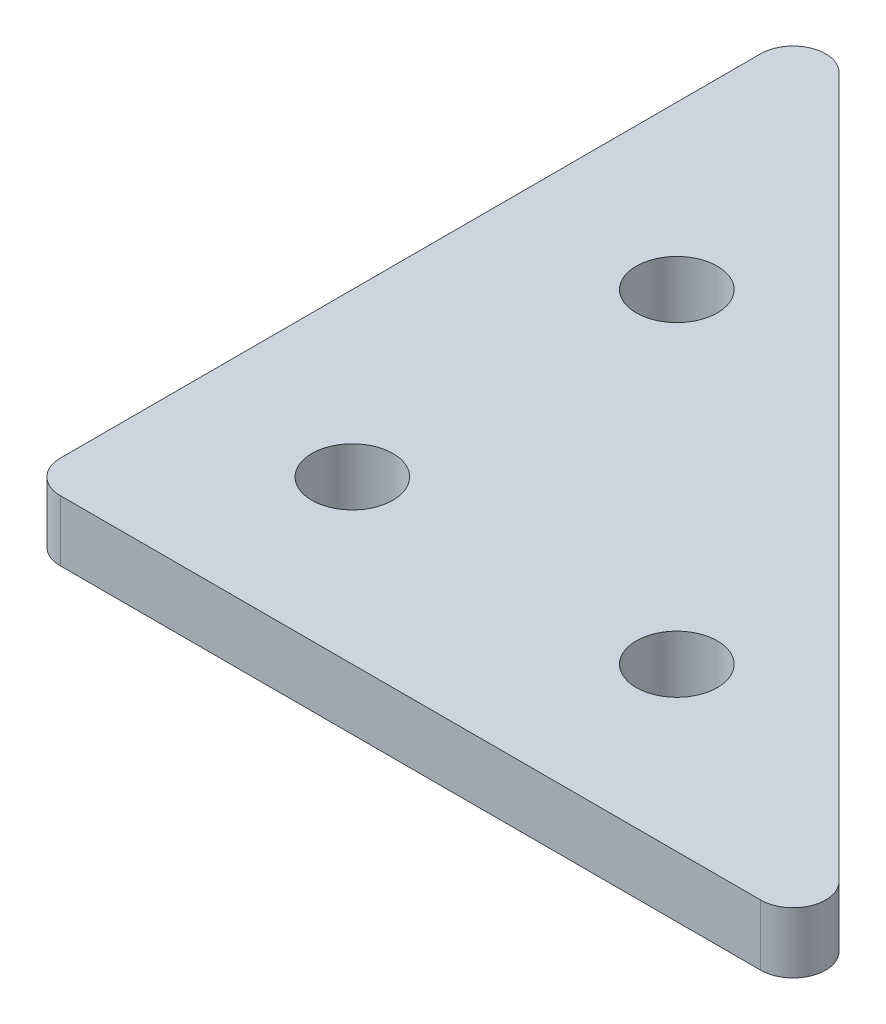
ISO-10303-21;
HEADER;
FILE_DESCRIPTION(('STEP AP214'),'2;1');
FILE_NAME('part.step','',(''),(''),'','','');
FILE_SCHEMA(('AUTOMOTIVE_DESIGN { 1 0 10303 214 1 1 1 1 }'));
ENDSEC;
DATA;
#1=APPLICATION_CONTEXT('core data for automotive mechanical design processes');
#2=APPLICATION_PROTOCOL_DEFINITION('international standard','automotive_design',2000,#1);
#3=PRODUCT_CONTEXT('',#1,'mechanical');
#4=PRODUCT('Part','Part','',(#3));
#5=PRODUCT_RELATED_PRODUCT_CATEGORY('part','',(#4));
#6=PRODUCT_DEFINITION_FORMATION('','',#4);
#7=PRODUCT_DEFINITION_CONTEXT('part definition',#1,'design');
#8=PRODUCT_DEFINITION('design','',#6,#7);
#9=PRODUCT_DEFINITION_SHAPE('','',#8);
#10=(LENGTH_UNIT() NAMED_UNIT(*) SI_UNIT(.MILLI.,.METRE.));
#11=(NAMED_UNIT(*) PLANE_ANGLE_UNIT() SI_UNIT($,.RADIAN.));
#12=(NAMED_UNIT(*) SI_UNIT($,.STERADIAN.) SOLID_ANGLE_UNIT());
#13=UNCERTAINTY_MEASURE_WITH_UNIT(LENGTH_MEASURE(1.E-05),#10,'distance_accuracy_value','');
#14=(GEOMETRIC_REPRESENTATION_CONTEXT(3) GLOBAL_UNCERTAINTY_ASSIGNED_CONTEXT((#13)) GLOBAL_UNIT_ASSIGNED_CONTEXT((#10,
#11,#12)) REPRESENTATION_CONTEXT('',''));
#15=CARTESIAN_POINT('',(0.,0.,0.));
#16=DIRECTION('',(0.,0.,1.));
#17=DIRECTION('',(1.,0.,0.));
#18=AXIS2_PLACEMENT_3D('',#15,#16,#17);
#19=CARTESIAN_POINT('',(-431.938028743073,4.7625,385.332748685498));
#20=DIRECTION('',(0.,-1.,0.));
#21=DIRECTION('',(0.,0.,-1.));
#22=AXIS2_PLACEMENT_3D('',#19,#20,#21);
#23=CYLINDRICAL_SURFACE('',#22,2.53999999999917);
#24=CARTESIAN_POINT('',(-431.938028743073,0.,385.332748685498));
#25=DIRECTION('',(0.,1.,0.));
#26=DIRECTION('',(0.,0.,-1.));
#27=AXIS2_PLACEMENT_3D('',#24,#25,#26);
#28=CIRCLE('',#27,2.53999999999917);
#29=CARTESIAN_POINT('',(-430.141977518862,0.,383.536697461284));
#30=VERTEX_POINT('',#29);
#31=CARTESIAN_POINT('',(-434.478028743073,0.,385.332748685498));
#32=VERTEX_POINT('',#31);
#33=EDGE_CURVE('E121',#30,#32,#28,.T.);
#34=ORIENTED_EDGE('',*,*,#33,.T.);
#35=DIRECTION('',(0.,-1.,0.));
#36=VECTOR('',#35,1.);
#37=CARTESIAN_POINT('',(-434.478028743073,4.7625,385.332748685498));
#38=LINE('',#37,#36);
#39=CARTESIAN_POINT('',(-434.478028743073,4.7625,385.332748685498));
#40=VERTEX_POINT('',#39);
#41=EDGE_CURVE('E11',#40,#32,#38,.T.);
#42=ORIENTED_EDGE('',*,*,#41,.F.);
#43=CARTESIAN_POINT('',(-431.938028743073,4.7625,385.332748685498));
#44=DIRECTION('',(0.,1.,0.));
#45=DIRECTION('',(0.,0.,-1.));
#46=AXIS2_PLACEMENT_3D('',#43,#44,#45);
#47=CIRCLE('',#46,2.53999999999917);
#48=CARTESIAN_POINT('',(-430.141977518862,4.7625,383.536697461284));
#49=VERTEX_POINT('',#48);
#50=EDGE_CURVE('E132',#49,#40,#47,.T.);
#51=ORIENTED_EDGE('',*,*,#50,.F.);
#52=DIRECTION('',(0.,-1.,0.));
#53=VECTOR('',#52,1.);
#54=CARTESIAN_POINT('',(-430.141977518862,4.7625,383.536697461284));
#55=LINE('',#54,#53);
#56=EDGE_CURVE('E117',#49,#30,#55,.T.);
#57=ORIENTED_EDGE('',*,*,#56,.T.);
#58=EDGE_LOOP('',(#34,#42,#51,#57));
#59=FACE_BOUND('',#58,.T.);
#60=ADVANCED_FACE('F37',(#59),#23,.T.);
#61=CARTESIAN_POINT('',(-434.478028743073,4.7625,440.16064623707));
#62=DIRECTION('',(1.,0.,0.));
#63=DIRECTION('',(0.,0.,-1.));
#64=AXIS2_PLACEMENT_3D('',#61,#62,#63);
#65=PLANE('',#64);
#66=DIRECTION('',(0.,0.,1.));
#67=VECTOR('',#66,1.);
#68=CARTESIAN_POINT('',(-434.478028743073,0.,440.16064623707));
#69=LINE('',#68,#67);
#70=CARTESIAN_POINT('',(-434.478028743073,0.,440.16064623707));
#71=VERTEX_POINT('',#70);
#72=EDGE_CURVE('E124',#32,#71,#69,.T.);
#73=ORIENTED_EDGE('',*,*,#72,.T.);
#74=DIRECTION('',(0.,-1.,0.));
#75=VECTOR('',#74,1.);
#76=CARTESIAN_POINT('',(-434.478028743073,4.7625,440.16064623707));
#77=LINE('',#76,#75);
#78=CARTESIAN_POINT('',(-434.478028743073,4.7625,440.16064623707));
#79=VERTEX_POINT('',#78);
#80=EDGE_CURVE('E45',#79,#71,#77,.T.);
#81=ORIENTED_EDGE('',*,*,#80,.F.);
#82=DIRECTION('',(0.,0.,1.));
#83=VECTOR('',#82,1.);
#84=CARTESIAN_POINT('',(-434.478028743073,4.7625,440.16064623707));
#85=LINE('',#84,#83);
#86=EDGE_CURVE('E90',#40,#79,#85,.T.);
#87=ORIENTED_EDGE('',*,*,#86,.F.);
#88=ORIENTED_EDGE('',*,*,#41,.T.);
#89=EDGE_LOOP('',(#73,#81,#87,#88));
#90=FACE_BOUND('',#89,.T.);
#91=ADVANCED_FACE('F157',(#90),#65,.F.);
#92=CARTESIAN_POINT('',(-431.938028743073,4.7625,440.160646237071));
#93=DIRECTION('',(0.,-1.,0.));
#94=DIRECTION('',(0.,0.,-1.));
#95=AXIS2_PLACEMENT_3D('',#92,#93,#94);
#96=CYLINDRICAL_SURFACE('',#95,2.53999999999999);
#97=CARTESIAN_POINT('',(-431.938028743073,0.,440.160646237071));
#98=DIRECTION('',(0.,1.,0.));
#99=DIRECTION('',(0.,0.,1.));
#100=AXIS2_PLACEMENT_3D('',#97,#98,#99);
#101=CIRCLE('',#100,2.53999999999999);
#102=CARTESIAN_POINT('',(-431.938028743073,0.,442.70064623707));
#103=VERTEX_POINT('',#102);
#104=EDGE_CURVE('E127',#71,#103,#101,.T.);
#105=ORIENTED_EDGE('',*,*,#104,.T.);
#106=DIRECTION('',(0.,-1.,0.));
#107=VECTOR('',#106,1.);
#108=CARTESIAN_POINT('',(-431.938028743073,4.7625,442.70064623707));
#109=LINE('',#108,#107);
#110=CARTESIAN_POINT('',(-431.938028743073,4.7625,442.70064623707));
#111=VERTEX_POINT('',#110);
#112=EDGE_CURVE('E112',#111,#103,#109,.T.);
#113=ORIENTED_EDGE('',*,*,#112,.F.);
#114=CARTESIAN_POINT('',(-431.938028743073,4.7625,440.160646237071));
#115=DIRECTION('',(0.,1.,0.));
#116=DIRECTION('',(0.,0.,1.));
#117=AXIS2_PLACEMENT_3D('',#114,#115,#116);
#118=CIRCLE('',#117,2.53999999999999);
#119=EDGE_CURVE('E103',#79,#111,#118,.T.);
#120=ORIENTED_EDGE('',*,*,#119,.F.);
#121=ORIENTED_EDGE('',*,*,#80,.T.);
#122=EDGE_LOOP('',(#105,#113,#120,#121));
#123=FACE_BOUND('',#122,.T.);
#124=ADVANCED_FACE('F138',(#123),#96,.T.);
#125=CARTESIAN_POINT('',(-431.938028743073,4.7625,442.70064623707));
#126=DIRECTION('',(0.,0.,-1.));
#127=DIRECTION('',(-1.,0.,0.));
#128=AXIS2_PLACEMENT_3D('',#125,#126,#127);
#129=PLANE('',#128);
#130=DIRECTION('',(1.,0.,0.));
#131=VECTOR('',#130,1.);
#132=CARTESIAN_POINT('',(-431.938028743073,0.,442.70064623707));
#133=LINE('',#132,#131);
#134=CARTESIAN_POINT('',(-377.110131191501,0.,442.70064623707));
#135=VERTEX_POINT('',#134);
#136=EDGE_CURVE('E111',#103,#135,#133,.T.);
#137=ORIENTED_EDGE('',*,*,#136,.T.);
#138=DIRECTION('',(0.,-1.,0.));
#139=VECTOR('',#138,1.);
#140=CARTESIAN_POINT('',(-377.110131191501,4.7625,442.70064623707));
#141=LINE('',#140,#139);
#142=CARTESIAN_POINT('',(-377.110131191501,4.7625,442.70064623707));
#143=VERTEX_POINT('',#142);
#144=EDGE_CURVE('E108',#143,#135,#141,.T.);
#145=ORIENTED_EDGE('',*,*,#144,.F.);
#146=DIRECTION('',(1.,0.,0.));
#147=VECTOR('',#146,1.);
#148=CARTESIAN_POINT('',(-431.938028743073,4.7625,442.70064623707));
#149=LINE('',#148,#147);
#150=EDGE_CURVE('E97',#111,#143,#149,.T.);
#151=ORIENTED_EDGE('',*,*,#150,.F.);
#152=ORIENTED_EDGE('',*,*,#112,.T.);
#153=EDGE_LOOP('',(#137,#145,#151,#152));
#154=FACE_BOUND('',#153,.T.);
#155=ADVANCED_FACE('F109',(#154),#129,.F.);
#156=CARTESIAN_POINT('',(-377.110131191501,4.7625,440.16064623707));
#157=DIRECTION('',(0.,-1.,0.));
#158=DIRECTION('',(0.,0.,-1.));
#159=AXIS2_PLACEMENT_3D('',#156,#157,#158);
#160=CYLINDRICAL_SURFACE('',#159,2.54000000000098);
#161=CARTESIAN_POINT('',(-377.110131191501,0.,440.16064623707));
#162=DIRECTION('',(0.,1.,0.));
#163=DIRECTION('',(0.,0.,-1.));
#164=AXIS2_PLACEMENT_3D('',#161,#162,#163);
#165=CIRCLE('',#164,2.54000000000098);
#166=CARTESIAN_POINT('',(-375.314079967288,0.,438.364595012854));
#167=VERTEX_POINT('',#166);
#168=EDGE_CURVE('E76',#135,#167,#165,.T.);
#169=ORIENTED_EDGE('',*,*,#168,.T.);
#170=DIRECTION('',(0.,-1.,0.));
#171=VECTOR('',#170,1.);
#172=CARTESIAN_POINT('',(-375.314079967288,4.7625,438.364595012854));
#173=LINE('',#172,#171);
#174=CARTESIAN_POINT('',(-375.314079967288,4.7625,438.364595012854));
#175=VERTEX_POINT('',#174);
#176=EDGE_CURVE('E113',#175,#167,#173,.T.);
#177=ORIENTED_EDGE('',*,*,#176,.F.);
#178=CARTESIAN_POINT('',(-377.110131191501,4.7625,440.16064623707));
#179=DIRECTION('',(0.,1.,0.));
#180=DIRECTION('',(0.,0.,-1.));
#181=AXIS2_PLACEMENT_3D('',#178,#179,#180);
#182=CIRCLE('',#181,2.54000000000098);
#183=EDGE_CURVE('E101',#143,#175,#182,.T.);
#184=ORIENTED_EDGE('',*,*,#183,.F.);
#185=ORIENTED_EDGE('',*,*,#144,.T.);
#186=EDGE_LOOP('',(#169,#177,#184,#185));
#187=FACE_BOUND('',#186,.T.);
#188=ADVANCED_FACE('F115',(#187),#160,.T.);
#189=CARTESIAN_POINT('',(-430.141977518862,4.7625,383.536697461284));
#190=DIRECTION('',(-0.707106781186514,0.,0.707106781186581));
#191=DIRECTION('',(0.707106781186581,0.,0.707106781186514));
#192=AXIS2_PLACEMENT_3D('',#189,#190,#191);
#193=PLANE('',#192);
#194=DIRECTION('',(-0.707106781186581,0.,-0.707106781186514));
#195=VECTOR('',#194,1.);
#196=CARTESIAN_POINT('',(-430.141977518862,0.,383.536697461284));
#197=LINE('',#196,#195);
#198=EDGE_CURVE('E82',#167,#30,#197,.T.);
#199=ORIENTED_EDGE('',*,*,#198,.T.);
#200=ORIENTED_EDGE('',*,*,#56,.F.);
#201=DIRECTION('',(-0.707106781186581,0.,-0.707106781186514));
#202=VECTOR('',#201,1.);
#203=CARTESIAN_POINT('',(-430.141977518862,4.7625,383.536697461284));
#204=LINE('',#203,#202);
#205=EDGE_CURVE('E53',#175,#49,#204,.T.);
#206=ORIENTED_EDGE('',*,*,#205,.F.);
#207=ORIENTED_EDGE('',*,*,#176,.T.);
#208=EDGE_LOOP('',(#199,#200,#206,#207));
#209=FACE_BOUND('',#208,.T.);
#210=ADVANCED_FACE('F145',(#209),#193,.F.);
#211=CARTESIAN_POINT('',(-431.938028743073,4.7625,385.332748685498));
#212=DIRECTION('',(0.,-1.,0.));
#213=DIRECTION('',(0.,0.,-1.));
#214=AXIS2_PLACEMENT_3D('',#211,#212,#213);
#215=PLANE('',#214);
#216=CARTESIAN_POINT('',(-421.77802874308,4.7625,404.600646237063));
#217=DIRECTION('',(0.,1.,0.));
#218=DIRECTION('',(0.,0.,1.));
#219=AXIS2_PLACEMENT_3D('',#216,#217,#218);
#220=CIRCLE('',#219,3.17499999999998);
#221=CARTESIAN_POINT('',(-421.77802874308,4.7625,407.775646237063));
#222=VERTEX_POINT('',#221);
#223=EDGE_CURVE('E269',#222,#222,#220,.T.);
#224=ORIENTED_EDGE('',*,*,#223,.F.);
#225=EDGE_LOOP('',(#224));
#226=FACE_BOUND('',#225,.T.);
#227=CARTESIAN_POINT('',(-421.77802874308,4.7625,430.000646237063));
#228=DIRECTION('',(0.,1.,0.));
#229=DIRECTION('',(0.,0.,1.));
#230=AXIS2_PLACEMENT_3D('',#227,#228,#229);
#231=CIRCLE('',#230,3.17499999999998);
#232=CARTESIAN_POINT('',(-421.77802874308,4.7625,433.175646237063));
#233=VERTEX_POINT('',#232);
#234=EDGE_CURVE('E271',#233,#233,#231,.T.);
#235=ORIENTED_EDGE('',*,*,#234,.F.);
#236=EDGE_LOOP('',(#235));
#237=FACE_BOUND('',#236,.T.);
#238=CARTESIAN_POINT('',(-396.37802874308,4.7625,430.000646237063));
#239=DIRECTION('',(0.,1.,0.));
#240=DIRECTION('',(0.,0.,1.));
#241=AXIS2_PLACEMENT_3D('',#238,#239,#240);
#242=CIRCLE('',#241,3.17499999999998);
#243=CARTESIAN_POINT('',(-396.37802874308,4.7625,433.175646237063));
#244=VERTEX_POINT('',#243);
#245=EDGE_CURVE('E279',#244,#244,#242,.T.);
#246=ORIENTED_EDGE('',*,*,#245,.F.);
#247=EDGE_LOOP('',(#246));
#248=FACE_BOUND('',#247,.T.);
#249=ORIENTED_EDGE('',*,*,#50,.T.);
#250=ORIENTED_EDGE('',*,*,#86,.T.);
#251=ORIENTED_EDGE('',*,*,#119,.T.);
#252=ORIENTED_EDGE('',*,*,#150,.T.);
#253=ORIENTED_EDGE('',*,*,#183,.T.);
#254=ORIENTED_EDGE('',*,*,#205,.T.);
#255=EDGE_LOOP('',(#249,#250,#251,#252,#253,#254));
#256=FACE_BOUND('',#255,.T.);
#257=ADVANCED_FACE('F99',(#226,#237,#248,#256),#215,.F.);
#258=CARTESIAN_POINT('',(-431.938028743073,0.,385.332748685498));
#259=DIRECTION('',(0.,-1.,0.));
#260=DIRECTION('',(0.,0.,-1.));
#261=AXIS2_PLACEMENT_3D('',#258,#259,#260);
#262=PLANE('',#261);
#263=CARTESIAN_POINT('',(-421.77802874308,0.,404.600646237063));
#264=DIRECTION('',(0.,1.,0.));
#265=DIRECTION('',(0.,0.,1.));
#266=AXIS2_PLACEMENT_3D('',#263,#264,#265);
#267=CIRCLE('',#266,3.17499999999998);
#268=CARTESIAN_POINT('',(-421.77802874308,0.,407.775646237063));
#269=VERTEX_POINT('',#268);
#270=EDGE_CURVE('E266',#269,#269,#267,.T.);
#271=ORIENTED_EDGE('',*,*,#270,.T.);
#272=EDGE_LOOP('',(#271));
#273=FACE_BOUND('',#272,.T.);
#274=CARTESIAN_POINT('',(-421.77802874308,0.,430.000646237063));
#275=DIRECTION('',(0.,1.,0.));
#276=DIRECTION('',(0.,0.,1.));
#277=AXIS2_PLACEMENT_3D('',#274,#275,#276);
#278=CIRCLE('',#277,3.17499999999998);
#279=CARTESIAN_POINT('',(-421.77802874308,0.,433.175646237063));
#280=VERTEX_POINT('',#279);
#281=EDGE_CURVE('E276',#280,#280,#278,.T.);
#282=ORIENTED_EDGE('',*,*,#281,.T.);
#283=EDGE_LOOP('',(#282));
#284=FACE_BOUND('',#283,.T.);
#285=CARTESIAN_POINT('',(-396.37802874308,0.,430.000646237063));
#286=DIRECTION('',(0.,1.,0.));
#287=DIRECTION('',(0.,0.,1.));
#288=AXIS2_PLACEMENT_3D('',#285,#286,#287);
#289=CIRCLE('',#288,3.17499999999998);
#290=CARTESIAN_POINT('',(-396.37802874308,0.,433.175646237063));
#291=VERTEX_POINT('',#290);
#292=EDGE_CURVE('E125',#291,#291,#289,.T.);
#293=ORIENTED_EDGE('',*,*,#292,.T.);
#294=EDGE_LOOP('',(#293));
#295=FACE_BOUND('',#294,.T.);
#296=ORIENTED_EDGE('',*,*,#33,.F.);
#297=ORIENTED_EDGE('',*,*,#198,.F.);
#298=ORIENTED_EDGE('',*,*,#168,.F.);
#299=ORIENTED_EDGE('',*,*,#136,.F.);
#300=ORIENTED_EDGE('',*,*,#104,.F.);
#301=ORIENTED_EDGE('',*,*,#72,.F.);
#302=EDGE_LOOP('',(#296,#297,#298,#299,#300,#301));
#303=FACE_BOUND('',#302,.T.);
#304=ADVANCED_FACE('F141',(#273,#284,#295,#303),#262,.T.);
#305=CARTESIAN_POINT('',(-396.37802874308,4.7625,430.000646237063));
#306=DIRECTION('',(0.,1.,0.));
#307=DIRECTION('',(0.,0.,1.));
#308=AXIS2_PLACEMENT_3D('',#305,#306,#307);
#309=CYLINDRICAL_SURFACE('',#308,3.17499999999998);
#310=ORIENTED_EDGE('',*,*,#292,.F.);
#311=EDGE_LOOP('',(#310));
#312=FACE_BOUND('',#311,.T.);
#313=ORIENTED_EDGE('',*,*,#245,.T.);
#314=EDGE_LOOP('',(#313));
#315=FACE_BOUND('',#314,.T.);
#316=ADVANCED_FACE('F197',(#312,#315),#309,.F.);
#317=CARTESIAN_POINT('',(-421.77802874308,4.7625,430.000646237063));
#318=DIRECTION('',(0.,1.,0.));
#319=DIRECTION('',(0.,0.,1.));
#320=AXIS2_PLACEMENT_3D('',#317,#318,#319);
#321=CYLINDRICAL_SURFACE('',#320,3.17499999999998);
#322=ORIENTED_EDGE('',*,*,#281,.F.);
#323=EDGE_LOOP('',(#322));
#324=FACE_BOUND('',#323,.T.);
#325=ORIENTED_EDGE('',*,*,#234,.T.);
#326=EDGE_LOOP('',(#325));
#327=FACE_BOUND('',#326,.T.);
#328=ADVANCED_FACE('F207',(#324,#327),#321,.F.);
#329=CARTESIAN_POINT('',(-421.77802874308,4.7625,404.600646237063));
#330=DIRECTION('',(0.,1.,0.));
#331=DIRECTION('',(0.,0.,1.));
#332=AXIS2_PLACEMENT_3D('',#329,#330,#331);
#333=CYLINDRICAL_SURFACE('',#332,3.17499999999998);
#334=ORIENTED_EDGE('',*,*,#270,.F.);
#335=EDGE_LOOP('',(#334));
#336=FACE_BOUND('',#335,.T.);
#337=ORIENTED_EDGE('',*,*,#223,.T.);
#338=EDGE_LOOP('',(#337));
#339=FACE_BOUND('',#338,.T.);
#340=ADVANCED_FACE('F218',(#336,#339),#333,.F.);
#341=CLOSED_SHELL('',(#60,#91,#124,#155,#188,#210,#257,#304,#316,#328,#340));
#342=MANIFOLD_SOLID_BREP('B2',#341);
#343=ADVANCED_BREP_SHAPE_REPRESENTATION('',(#18,#342),#14);
#344=SHAPE_DEFINITION_REPRESENTATION(#9,#343);
ENDSEC;
END-ISO-10303-21;
